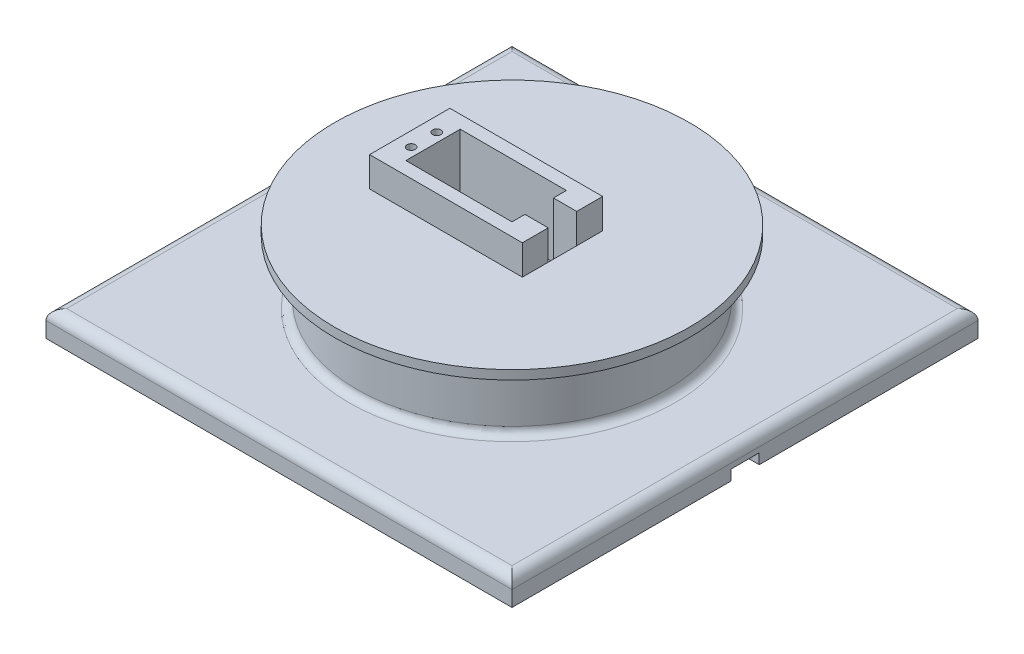
ISO-10303-21;
HEADER;
FILE_DESCRIPTION(('STEP AP214'),'2;1');
FILE_NAME('part.step','',(''),(''),'','','');
FILE_SCHEMA(('AUTOMOTIVE_DESIGN { 1 0 10303 214 1 1 1 1 }'));
ENDSEC;
DATA;
#1=APPLICATION_CONTEXT('core data for automotive mechanical design processes');
#2=APPLICATION_PROTOCOL_DEFINITION('international standard','automotive_design',2000,#1);
#3=PRODUCT_CONTEXT('',#1,'mechanical');
#4=PRODUCT('Part','Part','',(#3));
#5=PRODUCT_RELATED_PRODUCT_CATEGORY('part','',(#4));
#6=PRODUCT_DEFINITION_FORMATION('','',#4);
#7=PRODUCT_DEFINITION_CONTEXT('part definition',#1,'design');
#8=PRODUCT_DEFINITION('design','',#6,#7);
#9=PRODUCT_DEFINITION_SHAPE('','',#8);
#10=(LENGTH_UNIT() NAMED_UNIT(*) SI_UNIT(.MILLI.,.METRE.));
#11=(NAMED_UNIT(*) PLANE_ANGLE_UNIT() SI_UNIT($,.RADIAN.));
#12=(NAMED_UNIT(*) SI_UNIT($,.STERADIAN.) SOLID_ANGLE_UNIT());
#13=UNCERTAINTY_MEASURE_WITH_UNIT(LENGTH_MEASURE(1.E-05),#10,'distance_accuracy_value','');
#14=(GEOMETRIC_REPRESENTATION_CONTEXT(3) GLOBAL_UNCERTAINTY_ASSIGNED_CONTEXT((#13)) GLOBAL_UNIT_ASSIGNED_CONTEXT((#10,
#11,#12)) REPRESENTATION_CONTEXT('',''));
#15=CARTESIAN_POINT('',(0.,0.,0.));
#16=DIRECTION('',(0.,0.,1.));
#17=DIRECTION('',(1.,0.,0.));
#18=AXIS2_PLACEMENT_3D('',#15,#16,#17);
#19=CARTESIAN_POINT('',(19.5,49.5,-15.5));
#20=DIRECTION('',(-1.,0.,0.));
#21=DIRECTION('',(0.,0.,1.));
#22=AXIS2_PLACEMENT_3D('',#19,#20,#21);
#23=PLANE('',#22);
#24=DIRECTION('',(0.,0.,-1.));
#25=VECTOR('',#24,1.);
#26=CARTESIAN_POINT('',(19.5,49.5,-15.5));
#27=LINE('',#26,#25);
#28=CARTESIAN_POINT('',(19.5,49.5,-5.5));
#29=VERTEX_POINT('',#28);
#30=CARTESIAN_POINT('',(19.5,49.5,-15.5));
#31=VERTEX_POINT('',#30);
#32=EDGE_CURVE('E335',#29,#31,#27,.T.);
#33=ORIENTED_EDGE('',*,*,#32,.F.);
#34=DIRECTION('',(0.,1.,0.));
#35=VECTOR('',#34,1.);
#36=CARTESIAN_POINT('',(19.5,-14.2126704035519,-5.5));
#37=LINE('',#36,#35);
#38=CARTESIAN_POINT('',(19.5,38.,-5.5));
#39=VERTEX_POINT('',#38);
#40=EDGE_CURVE('E368',#39,#29,#37,.T.);
#41=ORIENTED_EDGE('',*,*,#40,.F.);
#42=DIRECTION('',(0.,0.,1.));
#43=VECTOR('',#42,1.);
#44=CARTESIAN_POINT('',(19.5,38.,0.));
#45=LINE('',#44,#43);
#46=CARTESIAN_POINT('',(19.5,38.,-15.5));
#47=VERTEX_POINT('',#46);
#48=EDGE_CURVE('E281',#47,#39,#45,.T.);
#49=ORIENTED_EDGE('',*,*,#48,.F.);
#50=DIRECTION('',(0.,-1.,0.));
#51=VECTOR('',#50,1.);
#52=CARTESIAN_POINT('',(19.5,49.5,-15.5));
#53=LINE('',#52,#51);
#54=EDGE_CURVE('E58',#31,#47,#53,.T.);
#55=ORIENTED_EDGE('',*,*,#54,.F.);
#56=EDGE_LOOP('',(#33,#41,#49,#55));
#57=FACE_BOUND('',#56,.T.);
#58=ADVANCED_FACE('F35',(#57),#23,.F.);
#59=CARTESIAN_POINT('',(10.5,23.,-10.5));
#60=DIRECTION('',(1.,0.,0.));
#61=DIRECTION('',(0.,0.,-1.));
#62=AXIS2_PLACEMENT_3D('',#59,#60,#61);
#63=PLANE('',#62);
#64=DIRECTION('',(0.,0.,-1.));
#65=VECTOR('',#64,1.);
#66=CARTESIAN_POINT('',(10.5,23.,-10.5));
#67=LINE('',#66,#65);
#68=CARTESIAN_POINT('',(10.5,23.,-5.5));
#69=VERTEX_POINT('',#68);
#70=CARTESIAN_POINT('',(10.5,23.,-10.5));
#71=VERTEX_POINT('',#70);
#72=EDGE_CURVE('E310',#69,#71,#67,.T.);
#73=ORIENTED_EDGE('',*,*,#72,.F.);
#74=DIRECTION('',(0.,1.,0.));
#75=VECTOR('',#74,1.);
#76=CARTESIAN_POINT('',(10.5,23.,-5.5));
#77=LINE('',#76,#75);
#78=CARTESIAN_POINT('',(10.5,49.5,-5.5));
#79=VERTEX_POINT('',#78);
#80=EDGE_CURVE('E11',#69,#79,#77,.T.);
#81=ORIENTED_EDGE('',*,*,#80,.T.);
#82=DIRECTION('',(0.,0.,-1.));
#83=VECTOR('',#82,1.);
#84=CARTESIAN_POINT('',(10.5,49.5,10.5));
#85=LINE('',#84,#83);
#86=CARTESIAN_POINT('',(10.5,49.5,-10.5));
#87=VERTEX_POINT('',#86);
#88=EDGE_CURVE('E345',#79,#87,#85,.T.);
#89=ORIENTED_EDGE('',*,*,#88,.T.);
#90=DIRECTION('',(0.,1.,0.));
#91=VECTOR('',#90,1.);
#92=CARTESIAN_POINT('',(10.5,23.,-10.5));
#93=LINE('',#92,#91);
#94=EDGE_CURVE('E477',#71,#87,#93,.T.);
#95=ORIENTED_EDGE('',*,*,#94,.F.);
#96=EDGE_LOOP('',(#73,#81,#89,#95));
#97=FACE_BOUND('',#96,.T.);
#98=ADVANCED_FACE('F435',(#97),#63,.F.);
#99=CARTESIAN_POINT('',(0.,38.,0.));
#100=DIRECTION('',(0.,1.,0.));
#101=DIRECTION('',(0.,0.,1.));
#102=AXIS2_PLACEMENT_3D('',#99,#100,#101);
#103=PLANE('',#102);
#104=CARTESIAN_POINT('',(0.,38.,0.));
#105=DIRECTION('',(0.,1.,0.));
#106=DIRECTION('',(0.,0.,1.));
#107=AXIS2_PLACEMENT_3D('',#104,#105,#106);
#108=CIRCLE('',#107,68.5);
#109=CARTESIAN_POINT('',(0.,38.,68.5));
#110=VERTEX_POINT('',#109);
#111=EDGE_CURVE('E225',#110,#110,#108,.T.);
#112=ORIENTED_EDGE('',*,*,#111,.T.);
#113=EDGE_LOOP('',(#112));
#114=FACE_BOUND('',#113,.T.);
#115=DIRECTION('',(-1.,0.,0.));
#116=VECTOR('',#115,1.);
#117=CARTESIAN_POINT('',(0.,38.,15.5));
#118=LINE('',#117,#116);
#119=CARTESIAN_POINT('',(19.5,38.,15.5));
#120=VERTEX_POINT('',#119);
#121=CARTESIAN_POINT('',(-39.5,38.,15.5));
#122=VERTEX_POINT('',#121);
#123=EDGE_CURVE('E284',#120,#122,#118,.T.);
#124=ORIENTED_EDGE('',*,*,#123,.T.);
#125=DIRECTION('',(0.,0.,-1.));
#126=VECTOR('',#125,1.);
#127=CARTESIAN_POINT('',(-39.5,38.,0.));
#128=LINE('',#127,#126);
#129=CARTESIAN_POINT('',(-39.5,38.,-15.5));
#130=VERTEX_POINT('',#129);
#131=EDGE_CURVE('E288',#122,#130,#128,.T.);
#132=ORIENTED_EDGE('',*,*,#131,.T.);
#133=DIRECTION('',(1.,0.,0.));
#134=VECTOR('',#133,1.);
#135=CARTESIAN_POINT('',(0.,38.,-15.5));
#136=LINE('',#135,#134);
#137=EDGE_CURVE('E277',#130,#47,#136,.T.);
#138=ORIENTED_EDGE('',*,*,#137,.T.);
#139=ORIENTED_EDGE('',*,*,#48,.T.);
#140=CARTESIAN_POINT('',(19.5,38.,5.5));
#141=VERTEX_POINT('',#140);
#142=EDGE_CURVE('E285',#39,#141,#45,.T.);
#143=ORIENTED_EDGE('',*,*,#142,.T.);
#144=EDGE_CURVE('E280',#141,#120,#45,.T.);
#145=ORIENTED_EDGE('',*,*,#144,.T.);
#146=EDGE_LOOP('',(#124,#132,#138,#139,#143,#145));
#147=FACE_BOUND('',#146,.T.);
#148=ADVANCED_FACE('F442',(#114,#147),#103,.T.);
#149=CARTESIAN_POINT('',(0.,38.,0.));
#150=DIRECTION('',(0.,-1.,0.));
#151=DIRECTION('',(0.,0.,-1.));
#152=AXIS2_PLACEMENT_3D('',#149,#150,#151);
#153=CYLINDRICAL_SURFACE('',#152,60.);
#154=CARTESIAN_POINT('',(0.,13.,0.));
#155=DIRECTION('',(0.,1.,0.));
#156=DIRECTION('',(0.,0.,1.));
#157=AXIS2_PLACEMENT_3D('',#154,#155,#156);
#158=CIRCLE('',#157,60.);
#159=CARTESIAN_POINT('',(0.,13.,60.));
#160=VERTEX_POINT('',#159);
#161=EDGE_CURVE('E258',#160,#160,#158,.T.);
#162=ORIENTED_EDGE('',*,*,#161,.T.);
#163=EDGE_LOOP('',(#162));
#164=FACE_BOUND('',#163,.T.);
#165=CARTESIAN_POINT('',(0.,34.5,0.));
#166=DIRECTION('',(0.,1.,0.));
#167=DIRECTION('',(0.,0.,1.));
#168=AXIS2_PLACEMENT_3D('',#165,#166,#167);
#169=CIRCLE('',#168,60.);
#170=CARTESIAN_POINT('',(0.,34.5,60.));
#171=VERTEX_POINT('',#170);
#172=EDGE_CURVE('E274',#171,#171,#169,.T.);
#173=ORIENTED_EDGE('',*,*,#172,.F.);
#174=EDGE_LOOP('',(#173));
#175=FACE_BOUND('',#174,.T.);
#176=ADVANCED_FACE('F509',(#164,#175),#153,.T.);
#177=CARTESIAN_POINT('',(90.,10.,-90.));
#178=DIRECTION('',(-1.,0.,0.));
#179=DIRECTION('',(0.,0.,1.));
#180=AXIS2_PLACEMENT_3D('',#177,#178,#179);
#181=PLANE('',#180);
#182=DIRECTION('',(0.,0.,-1.));
#183=VECTOR('',#182,1.);
#184=CARTESIAN_POINT('',(90.,4.,-5.5));
#185=LINE('',#184,#183);
#186=CARTESIAN_POINT('',(90.,4.,5.5));
#187=VERTEX_POINT('',#186);
#188=CARTESIAN_POINT('',(90.,4.,-5.5));
#189=VERTEX_POINT('',#188);
#190=EDGE_CURVE('E210',#187,#189,#185,.T.);
#191=ORIENTED_EDGE('',*,*,#190,.T.);
#192=DIRECTION('',(0.,-1.,0.));
#193=VECTOR('',#192,1.);
#194=CARTESIAN_POINT('',(90.,0.,-5.5));
#195=LINE('',#194,#193);
#196=CARTESIAN_POINT('',(90.,0.,-5.5));
#197=VERTEX_POINT('',#196);
#198=EDGE_CURVE('E382',#189,#197,#195,.T.);
#199=ORIENTED_EDGE('',*,*,#198,.T.);
#200=DIRECTION('',(0.,0.,-1.));
#201=VECTOR('',#200,1.);
#202=CARTESIAN_POINT('',(90.,0.,-90.));
#203=LINE('',#202,#201);
#204=CARTESIAN_POINT('',(90.,0.,-90.));
#205=VERTEX_POINT('',#204);
#206=EDGE_CURVE('E218',#197,#205,#203,.T.);
#207=ORIENTED_EDGE('',*,*,#206,.T.);
#208=DIRECTION('',(0.,-1.,0.));
#209=VECTOR('',#208,1.);
#210=CARTESIAN_POINT('',(90.,10.,-90.));
#211=LINE('',#210,#209);
#212=CARTESIAN_POINT('',(90.,6.,-90.));
#213=VERTEX_POINT('',#212);
#214=EDGE_CURVE('E237',#213,#205,#211,.T.);
#215=ORIENTED_EDGE('',*,*,#214,.F.);
#216=DIRECTION('',(0.,0.,-1.));
#217=VECTOR('',#216,1.);
#218=CARTESIAN_POINT('',(90.,6.,90.));
#219=LINE('',#218,#217);
#220=CARTESIAN_POINT('',(90.,6.,90.));
#221=VERTEX_POINT('',#220);
#222=EDGE_CURVE('E254',#213,#221,#219,.F.);
#223=ORIENTED_EDGE('',*,*,#222,.T.);
#224=DIRECTION('',(0.,-1.,0.));
#225=VECTOR('',#224,1.);
#226=CARTESIAN_POINT('',(90.,10.,90.));
#227=LINE('',#226,#225);
#228=CARTESIAN_POINT('',(90.,0.,90.));
#229=VERTEX_POINT('',#228);
#230=EDGE_CURVE('E215',#221,#229,#227,.T.);
#231=ORIENTED_EDGE('',*,*,#230,.T.);
#232=CARTESIAN_POINT('',(90.,0.,5.5));
#233=VERTEX_POINT('',#232);
#234=EDGE_CURVE('E197',#229,#233,#203,.T.);
#235=ORIENTED_EDGE('',*,*,#234,.T.);
#236=DIRECTION('',(0.,1.,0.));
#237=VECTOR('',#236,1.);
#238=CARTESIAN_POINT('',(90.,0.,5.5));
#239=LINE('',#238,#237);
#240=EDGE_CURVE('E203',#233,#187,#239,.T.);
#241=ORIENTED_EDGE('',*,*,#240,.T.);
#242=EDGE_LOOP('',(#191,#199,#207,#215,#223,#231,#235,#241));
#243=FACE_BOUND('',#242,.T.);
#244=ADVANCED_FACE('F213',(#243),#181,.F.);
#245=CARTESIAN_POINT('',(-90.,10.,-90.));
#246=DIRECTION('',(0.,0.,1.));
#247=DIRECTION('',(1.,0.,0.));
#248=AXIS2_PLACEMENT_3D('',#245,#246,#247);
#249=PLANE('',#248);
#250=DIRECTION('',(0.,-1.,0.));
#251=VECTOR('',#250,1.);
#252=CARTESIAN_POINT('',(-90.,10.,-90.));
#253=LINE('',#252,#251);
#254=CARTESIAN_POINT('',(-90.,6.,-90.));
#255=VERTEX_POINT('',#254);
#256=CARTESIAN_POINT('',(-90.,0.,-90.));
#257=VERTEX_POINT('',#256);
#258=EDGE_CURVE('E235',#255,#257,#253,.T.);
#259=ORIENTED_EDGE('',*,*,#258,.F.);
#260=DIRECTION('',(-1.,0.,0.));
#261=VECTOR('',#260,1.);
#262=CARTESIAN_POINT('',(90.,6.,-90.));
#263=LINE('',#262,#261);
#264=EDGE_CURVE('E249',#255,#213,#263,.F.);
#265=ORIENTED_EDGE('',*,*,#264,.T.);
#266=ORIENTED_EDGE('',*,*,#214,.T.);
#267=DIRECTION('',(-1.,0.,0.));
#268=VECTOR('',#267,1.);
#269=CARTESIAN_POINT('',(-90.,0.,-90.));
#270=LINE('',#269,#268);
#271=EDGE_CURVE('E217',#205,#257,#270,.T.);
#272=ORIENTED_EDGE('',*,*,#271,.T.);
#273=EDGE_LOOP('',(#259,#265,#266,#272));
#274=FACE_BOUND('',#273,.T.);
#275=ADVANCED_FACE('F401',(#274),#249,.F.);
#276=CARTESIAN_POINT('',(-90.,10.,-90.));
#277=DIRECTION('',(1.,0.,0.));
#278=DIRECTION('',(0.,0.,-1.));
#279=AXIS2_PLACEMENT_3D('',#276,#277,#278);
#280=PLANE('',#279);
#281=DIRECTION('',(0.,-1.,0.));
#282=VECTOR('',#281,1.);
#283=CARTESIAN_POINT('',(-90.,10.,90.));
#284=LINE('',#283,#282);
#285=CARTESIAN_POINT('',(-90.,6.,90.));
#286=VERTEX_POINT('',#285);
#287=CARTESIAN_POINT('',(-90.,0.,90.));
#288=VERTEX_POINT('',#287);
#289=EDGE_CURVE('E233',#286,#288,#284,.T.);
#290=ORIENTED_EDGE('',*,*,#289,.F.);
#291=DIRECTION('',(0.,0.,1.));
#292=VECTOR('',#291,1.);
#293=CARTESIAN_POINT('',(-90.,6.,-90.));
#294=LINE('',#293,#292);
#295=EDGE_CURVE('E252',#286,#255,#294,.F.);
#296=ORIENTED_EDGE('',*,*,#295,.T.);
#297=ORIENTED_EDGE('',*,*,#258,.T.);
#298=DIRECTION('',(0.,0.,1.));
#299=VECTOR('',#298,1.);
#300=CARTESIAN_POINT('',(-90.,0.,-90.));
#301=LINE('',#300,#299);
#302=EDGE_CURVE('E221',#257,#288,#301,.T.);
#303=ORIENTED_EDGE('',*,*,#302,.T.);
#304=EDGE_LOOP('',(#290,#296,#297,#303));
#305=FACE_BOUND('',#304,.T.);
#306=ADVANCED_FACE('F518',(#305),#280,.F.);
#307=CARTESIAN_POINT('',(-90.,10.,90.));
#308=DIRECTION('',(0.,0.,-1.));
#309=DIRECTION('',(-1.,0.,0.));
#310=AXIS2_PLACEMENT_3D('',#307,#308,#309);
#311=PLANE('',#310);
#312=ORIENTED_EDGE('',*,*,#230,.F.);
#313=DIRECTION('',(1.,0.,0.));
#314=VECTOR('',#313,1.);
#315=CARTESIAN_POINT('',(-90.,6.,90.));
#316=LINE('',#315,#314);
#317=EDGE_CURVE('E256',#221,#286,#316,.F.);
#318=ORIENTED_EDGE('',*,*,#317,.T.);
#319=ORIENTED_EDGE('',*,*,#289,.T.);
#320=DIRECTION('',(1.,0.,0.));
#321=VECTOR('',#320,1.);
#322=CARTESIAN_POINT('',(-90.,0.,90.));
#323=LINE('',#322,#321);
#324=EDGE_CURVE('E230',#288,#229,#323,.T.);
#325=ORIENTED_EDGE('',*,*,#324,.T.);
#326=EDGE_LOOP('',(#312,#318,#319,#325));
#327=FACE_BOUND('',#326,.T.);
#328=ADVANCED_FACE('F423',(#327),#311,.F.);
#329=CARTESIAN_POINT('',(0.,10.,0.));
#330=DIRECTION('',(0.,1.,0.));
#331=DIRECTION('',(0.,0.,1.));
#332=AXIS2_PLACEMENT_3D('',#329,#330,#331);
#333=PLANE('',#332);
#334=CARTESIAN_POINT('',(0.,10.,0.));
#335=DIRECTION('',(0.,1.,0.));
#336=DIRECTION('',(0.,0.,1.));
#337=AXIS2_PLACEMENT_3D('',#334,#335,#336);
#338=CIRCLE('',#337,63.);
#339=CARTESIAN_POINT('',(0.,10.,63.));
#340=VERTEX_POINT('',#339);
#341=EDGE_CURVE('E271',#340,#340,#338,.F.);
#342=ORIENTED_EDGE('',*,*,#341,.T.);
#343=EDGE_LOOP('',(#342));
#344=FACE_BOUND('',#343,.T.);
#345=DIRECTION('',(0.,0.,-1.));
#346=VECTOR('',#345,1.);
#347=CARTESIAN_POINT('',(86.,10.,-90.));
#348=LINE('',#347,#346);
#349=CARTESIAN_POINT('',(86.,10.,86.));
#350=VERTEX_POINT('',#349);
#351=CARTESIAN_POINT('',(86.,10.,-86.));
#352=VERTEX_POINT('',#351);
#353=EDGE_CURVE('E242',#350,#352,#348,.T.);
#354=ORIENTED_EDGE('',*,*,#353,.T.);
#355=DIRECTION('',(-1.,0.,0.));
#356=VECTOR('',#355,1.);
#357=CARTESIAN_POINT('',(-90.,10.,-86.));
#358=LINE('',#357,#356);
#359=CARTESIAN_POINT('',(-86.,10.,-86.));
#360=VERTEX_POINT('',#359);
#361=EDGE_CURVE('E246',#352,#360,#358,.T.);
#362=ORIENTED_EDGE('',*,*,#361,.T.);
#363=DIRECTION('',(0.,0.,1.));
#364=VECTOR('',#363,1.);
#365=CARTESIAN_POINT('',(-86.,10.,90.));
#366=LINE('',#365,#364);
#367=CARTESIAN_POINT('',(-86.,10.,86.));
#368=VERTEX_POINT('',#367);
#369=EDGE_CURVE('E244',#360,#368,#366,.T.);
#370=ORIENTED_EDGE('',*,*,#369,.T.);
#371=DIRECTION('',(1.,0.,0.));
#372=VECTOR('',#371,1.);
#373=CARTESIAN_POINT('',(90.,10.,86.));
#374=LINE('',#373,#372);
#375=EDGE_CURVE('E240',#368,#350,#374,.T.);
#376=ORIENTED_EDGE('',*,*,#375,.T.);
#377=EDGE_LOOP('',(#354,#362,#370,#376));
#378=FACE_BOUND('',#377,.T.);
#379=ADVANCED_FACE('F416',(#344,#378),#333,.T.);
#380=CARTESIAN_POINT('',(0.,0.,0.));
#381=DIRECTION('',(0.,1.,0.));
#382=DIRECTION('',(0.,0.,1.));
#383=AXIS2_PLACEMENT_3D('',#380,#381,#382);
#384=PLANE('',#383);
#385=ORIENTED_EDGE('',*,*,#206,.F.);
#386=DIRECTION('',(1.,0.,0.));
#387=VECTOR('',#386,1.);
#388=CARTESIAN_POINT('',(10.5,0.,-5.5));
#389=LINE('',#388,#387);
#390=CARTESIAN_POINT('',(10.5,0.,-5.5));
#391=VERTEX_POINT('',#390);
#392=EDGE_CURVE('E374',#391,#197,#389,.T.);
#393=ORIENTED_EDGE('',*,*,#392,.F.);
#394=DIRECTION('',(0.,0.,-1.));
#395=VECTOR('',#394,1.);
#396=CARTESIAN_POINT('',(10.5,0.,5.5));
#397=LINE('',#396,#395);
#398=CARTESIAN_POINT('',(10.5,0.,5.5));
#399=VERTEX_POINT('',#398);
#400=EDGE_CURVE('E199',#399,#391,#397,.T.);
#401=ORIENTED_EDGE('',*,*,#400,.F.);
#402=DIRECTION('',(-1.,0.,0.));
#403=VECTOR('',#402,1.);
#404=CARTESIAN_POINT('',(10.5,0.,5.5));
#405=LINE('',#404,#403);
#406=EDGE_CURVE('E191',#233,#399,#405,.T.);
#407=ORIENTED_EDGE('',*,*,#406,.F.);
#408=ORIENTED_EDGE('',*,*,#234,.F.);
#409=ORIENTED_EDGE('',*,*,#324,.F.);
#410=ORIENTED_EDGE('',*,*,#302,.F.);
#411=ORIENTED_EDGE('',*,*,#271,.F.);
#412=EDGE_LOOP('',(#385,#393,#401,#407,#408,#409,#410,#411));
#413=FACE_BOUND('',#412,.T.);
#414=ADVANCED_FACE('F194',(#413),#384,.F.);
#415=CARTESIAN_POINT('',(0.,6.,86.));
#416=DIRECTION('',(-1.,0.,0.));
#417=DIRECTION('',(0.,0.,1.));
#418=AXIS2_PLACEMENT_3D('',#415,#416,#417);
#419=CYLINDRICAL_SURFACE('',#418,4.);
#420=CARTESIAN_POINT('',(-86.,6.,86.));
#421=DIRECTION('',(-0.707106781186548,0.,-0.707106781186547));
#422=DIRECTION('',(-0.707106781186547,0.,0.707106781186548));
#423=AXIS2_PLACEMENT_3D('',#420,#421,#422);
#424=ELLIPSE('',#423,5.65685424949238,4.);
#425=EDGE_CURVE('E264',#286,#368,#424,.T.);
#426=ORIENTED_EDGE('',*,*,#425,.F.);
#427=ORIENTED_EDGE('',*,*,#317,.F.);
#428=CARTESIAN_POINT('',(86.,6.,86.));
#429=DIRECTION('',(-0.707106781186547,0.,0.707106781186548));
#430=DIRECTION('',(-0.707106781186548,0.,-0.707106781186547));
#431=AXIS2_PLACEMENT_3D('',#428,#429,#430);
#432=ELLIPSE('',#431,5.65685424949238,4.);
#433=EDGE_CURVE('E223',#350,#221,#432,.F.);
#434=ORIENTED_EDGE('',*,*,#433,.F.);
#435=ORIENTED_EDGE('',*,*,#375,.F.);
#436=EDGE_LOOP('',(#426,#427,#434,#435));
#437=FACE_BOUND('',#436,.T.);
#438=ADVANCED_FACE('F426',(#437),#419,.T.);
#439=CARTESIAN_POINT('',(86.,6.,0.));
#440=DIRECTION('',(0.,0.,1.));
#441=DIRECTION('',(1.,0.,0.));
#442=AXIS2_PLACEMENT_3D('',#439,#440,#441);
#443=CYLINDRICAL_SURFACE('',#442,4.);
#444=ORIENTED_EDGE('',*,*,#433,.T.);
#445=ORIENTED_EDGE('',*,*,#222,.F.);
#446=CARTESIAN_POINT('',(86.,6.,-86.));
#447=DIRECTION('',(0.707106781186548,0.,0.707106781186547));
#448=DIRECTION('',(-0.707106781186547,0.,0.707106781186548));
#449=AXIS2_PLACEMENT_3D('',#446,#447,#448);
#450=ELLIPSE('',#449,5.65685424949238,4.);
#451=EDGE_CURVE('E261',#352,#213,#450,.F.);
#452=ORIENTED_EDGE('',*,*,#451,.F.);
#453=ORIENTED_EDGE('',*,*,#353,.F.);
#454=EDGE_LOOP('',(#444,#445,#452,#453));
#455=FACE_BOUND('',#454,.T.);
#456=ADVANCED_FACE('F420',(#455),#443,.T.);
#457=CARTESIAN_POINT('',(-86.,6.,0.));
#458=DIRECTION('',(0.,0.,-1.));
#459=DIRECTION('',(-1.,0.,0.));
#460=AXIS2_PLACEMENT_3D('',#457,#458,#459);
#461=CYLINDRICAL_SURFACE('',#460,4.);
#462=ORIENTED_EDGE('',*,*,#425,.T.);
#463=ORIENTED_EDGE('',*,*,#369,.F.);
#464=CARTESIAN_POINT('',(-86.,6.,-86.));
#465=DIRECTION('',(0.707106781186547,0.,-0.707106781186548));
#466=DIRECTION('',(-0.707106781186548,0.,-0.707106781186547));
#467=AXIS2_PLACEMENT_3D('',#464,#465,#466);
#468=ELLIPSE('',#467,5.65685424949238,4.);
#469=EDGE_CURVE('E259',#255,#360,#468,.T.);
#470=ORIENTED_EDGE('',*,*,#469,.F.);
#471=ORIENTED_EDGE('',*,*,#295,.F.);
#472=EDGE_LOOP('',(#462,#463,#470,#471));
#473=FACE_BOUND('',#472,.T.);
#474=ADVANCED_FACE('F412',(#473),#461,.T.);
#475=CARTESIAN_POINT('',(0.,6.,-86.));
#476=DIRECTION('',(1.,0.,0.));
#477=DIRECTION('',(0.,0.,-1.));
#478=AXIS2_PLACEMENT_3D('',#475,#476,#477);
#479=CYLINDRICAL_SURFACE('',#478,4.);
#480=ORIENTED_EDGE('',*,*,#451,.T.);
#481=ORIENTED_EDGE('',*,*,#264,.F.);
#482=ORIENTED_EDGE('',*,*,#469,.T.);
#483=ORIENTED_EDGE('',*,*,#361,.F.);
#484=EDGE_LOOP('',(#480,#481,#482,#483));
#485=FACE_BOUND('',#484,.T.);
#486=ADVANCED_FACE('F405',(#485),#479,.T.);
#487=CARTESIAN_POINT('',(0.,13.,0.));
#488=DIRECTION('',(0.,1.,0.));
#489=DIRECTION('',(0.,0.,1.));
#490=AXIS2_PLACEMENT_3D('',#487,#488,#489);
#491=TOROIDAL_SURFACE('',#490,63.,3.);
#492=ORIENTED_EDGE('',*,*,#341,.F.);
#493=EDGE_LOOP('',(#492));
#494=FACE_BOUND('',#493,.T.);
#495=ORIENTED_EDGE('',*,*,#161,.F.);
#496=EDGE_LOOP('',(#495));
#497=FACE_BOUND('',#496,.T.);
#498=ADVANCED_FACE('F37',(#494,#497),#491,.F.);
#499=CARTESIAN_POINT('',(0.,34.5,0.));
#500=DIRECTION('',(0.,1.,0.));
#501=DIRECTION('',(0.,0.,1.));
#502=AXIS2_PLACEMENT_3D('',#499,#500,#501);
#503=CYLINDRICAL_SURFACE('',#502,68.5);
#504=CARTESIAN_POINT('',(0.,34.5,0.));
#505=DIRECTION('',(0.,1.,0.));
#506=DIRECTION('',(0.,0.,1.));
#507=AXIS2_PLACEMENT_3D('',#504,#505,#506);
#508=CIRCLE('',#507,68.5);
#509=CARTESIAN_POINT('',(0.,34.5,68.5));
#510=VERTEX_POINT('',#509);
#511=EDGE_CURVE('E262',#510,#510,#508,.T.);
#512=ORIENTED_EDGE('',*,*,#511,.T.);
#513=EDGE_LOOP('',(#512));
#514=FACE_BOUND('',#513,.T.);
#515=ORIENTED_EDGE('',*,*,#111,.F.);
#516=EDGE_LOOP('',(#515));
#517=FACE_BOUND('',#516,.T.);
#518=ADVANCED_FACE('F494',(#514,#517),#503,.T.);
#519=CARTESIAN_POINT('',(0.,34.5,0.));
#520=DIRECTION('',(0.,1.,0.));
#521=DIRECTION('',(0.,0.,1.));
#522=AXIS2_PLACEMENT_3D('',#519,#520,#521);
#523=PLANE('',#522);
#524=ORIENTED_EDGE('',*,*,#172,.T.);
#525=EDGE_LOOP('',(#524));
#526=FACE_BOUND('',#525,.T.);
#527=ORIENTED_EDGE('',*,*,#511,.F.);
#528=EDGE_LOOP('',(#527));
#529=FACE_BOUND('',#528,.T.);
#530=ADVANCED_FACE('F496',(#526,#529),#523,.F.);
#531=CARTESIAN_POINT('',(0.,49.5,0.));
#532=DIRECTION('',(0.,-1.,0.));
#533=DIRECTION('',(0.,0.,-1.));
#534=AXIS2_PLACEMENT_3D('',#531,#532,#533);
#535=PLANE('',#534);
#536=CARTESIAN_POINT('',(-34.,49.5,-4.95));
#537=DIRECTION('',(0.,1.,0.));
#538=DIRECTION('',(0.,0.,1.));
#539=AXIS2_PLACEMENT_3D('',#536,#537,#538);
#540=CIRCLE('',#539,1.6);
#541=CARTESIAN_POINT('',(-34.,49.5,-3.35000000000001));
#542=VERTEX_POINT('',#541);
#543=EDGE_CURVE('E200',#542,#542,#540,.T.);
#544=ORIENTED_EDGE('',*,*,#543,.F.);
#545=EDGE_LOOP('',(#544));
#546=FACE_BOUND('',#545,.T.);
#547=CARTESIAN_POINT('',(-34.,49.5,4.95));
#548=DIRECTION('',(0.,1.,0.));
#549=DIRECTION('',(0.,0.,1.));
#550=AXIS2_PLACEMENT_3D('',#547,#548,#549);
#551=CIRCLE('',#550,1.6);
#552=CARTESIAN_POINT('',(-34.,49.5,6.55));
#553=VERTEX_POINT('',#552);
#554=EDGE_CURVE('E355',#553,#553,#551,.T.);
#555=ORIENTED_EDGE('',*,*,#554,.F.);
#556=EDGE_LOOP('',(#555));
#557=FACE_BOUND('',#556,.T.);
#558=ORIENTED_EDGE('',*,*,#88,.F.);
#559=DIRECTION('',(-1.,0.,0.));
#560=VECTOR('',#559,1.);
#561=CARTESIAN_POINT('',(10.5,49.5,-5.5));
#562=LINE('',#561,#560);
#563=EDGE_CURVE('E365',#29,#79,#562,.T.);
#564=ORIENTED_EDGE('',*,*,#563,.F.);
#565=ORIENTED_EDGE('',*,*,#32,.T.);
#566=DIRECTION('',(-1.,0.,0.));
#567=VECTOR('',#566,1.);
#568=CARTESIAN_POINT('',(19.5,49.5,-15.5));
#569=LINE('',#568,#567);
#570=CARTESIAN_POINT('',(-39.5,49.5,-15.5));
#571=VERTEX_POINT('',#570);
#572=EDGE_CURVE('E330',#31,#571,#569,.T.);
#573=ORIENTED_EDGE('',*,*,#572,.T.);
#574=DIRECTION('',(0.,0.,1.));
#575=VECTOR('',#574,1.);
#576=CARTESIAN_POINT('',(-39.5,49.5,-15.5));
#577=LINE('',#576,#575);
#578=CARTESIAN_POINT('',(-39.5,49.5,15.5));
#579=VERTEX_POINT('',#578);
#580=EDGE_CURVE('E338',#571,#579,#577,.T.);
#581=ORIENTED_EDGE('',*,*,#580,.T.);
#582=DIRECTION('',(1.,0.,0.));
#583=VECTOR('',#582,1.);
#584=CARTESIAN_POINT('',(19.5,49.5,15.5));
#585=LINE('',#584,#583);
#586=CARTESIAN_POINT('',(19.5,49.5,15.5));
#587=VERTEX_POINT('',#586);
#588=EDGE_CURVE('E336',#579,#587,#585,.T.);
#589=ORIENTED_EDGE('',*,*,#588,.T.);
#590=CARTESIAN_POINT('',(19.5,49.5,5.5));
#591=VERTEX_POINT('',#590);
#592=EDGE_CURVE('E332',#587,#591,#27,.T.);
#593=ORIENTED_EDGE('',*,*,#592,.T.);
#594=DIRECTION('',(1.,0.,0.));
#595=VECTOR('',#594,1.);
#596=CARTESIAN_POINT('',(10.5,49.5,5.5));
#597=LINE('',#596,#595);
#598=CARTESIAN_POINT('',(10.5,49.5,5.5));
#599=VERTEX_POINT('',#598);
#600=EDGE_CURVE('E376',#599,#591,#597,.T.);
#601=ORIENTED_EDGE('',*,*,#600,.F.);
#602=CARTESIAN_POINT('',(10.5,49.5,10.5));
#603=VERTEX_POINT('',#602);
#604=EDGE_CURVE('E299',#603,#599,#85,.T.);
#605=ORIENTED_EDGE('',*,*,#604,.F.);
#606=DIRECTION('',(1.,0.,0.));
#607=VECTOR('',#606,1.);
#608=CARTESIAN_POINT('',(-30.5,49.5,10.5));
#609=LINE('',#608,#607);
#610=CARTESIAN_POINT('',(-30.5,49.5,10.5));
#611=VERTEX_POINT('',#610);
#612=EDGE_CURVE('E346',#611,#603,#609,.T.);
#613=ORIENTED_EDGE('',*,*,#612,.F.);
#614=DIRECTION('',(0.,0.,1.));
#615=VECTOR('',#614,1.);
#616=CARTESIAN_POINT('',(-30.5,49.5,-10.5));
#617=LINE('',#616,#615);
#618=CARTESIAN_POINT('',(-30.5,49.5,-10.5));
#619=VERTEX_POINT('',#618);
#620=EDGE_CURVE('E349',#619,#611,#617,.T.);
#621=ORIENTED_EDGE('',*,*,#620,.F.);
#622=DIRECTION('',(-1.,0.,0.));
#623=VECTOR('',#622,1.);
#624=CARTESIAN_POINT('',(10.5,49.5,-10.5));
#625=LINE('',#624,#623);
#626=EDGE_CURVE('E341',#87,#619,#625,.T.);
#627=ORIENTED_EDGE('',*,*,#626,.F.);
#628=EDGE_LOOP('',(#558,#564,#565,#573,#581,#589,#593,#601,#605,#613,#621,#627));
#629=FACE_BOUND('',#628,.T.);
#630=ADVANCED_FACE('F473',(#546,#557,#629),#535,.F.);
#631=CARTESIAN_POINT('',(-39.5,49.5,-15.5));
#632=DIRECTION('',(1.,0.,0.));
#633=DIRECTION('',(0.,0.,-1.));
#634=AXIS2_PLACEMENT_3D('',#631,#632,#633);
#635=PLANE('',#634);
#636=ORIENTED_EDGE('',*,*,#131,.F.);
#637=DIRECTION('',(0.,-1.,0.));
#638=VECTOR('',#637,1.);
#639=CARTESIAN_POINT('',(-39.5,49.5,15.5));
#640=LINE('',#639,#638);
#641=EDGE_CURVE('E318',#579,#122,#640,.T.);
#642=ORIENTED_EDGE('',*,*,#641,.F.);
#643=ORIENTED_EDGE('',*,*,#580,.F.);
#644=DIRECTION('',(0.,-1.,0.));
#645=VECTOR('',#644,1.);
#646=CARTESIAN_POINT('',(-39.5,49.5,-15.5));
#647=LINE('',#646,#645);
#648=EDGE_CURVE('E327',#571,#130,#647,.T.);
#649=ORIENTED_EDGE('',*,*,#648,.T.);
#650=EDGE_LOOP('',(#636,#642,#643,#649));
#651=FACE_BOUND('',#650,.T.);
#652=ADVANCED_FACE('F456',(#651),#635,.F.);
#653=CARTESIAN_POINT('',(19.5,49.5,15.5));
#654=DIRECTION('',(0.,0.,-1.));
#655=DIRECTION('',(-1.,0.,0.));
#656=AXIS2_PLACEMENT_3D('',#653,#654,#655);
#657=PLANE('',#656);
#658=ORIENTED_EDGE('',*,*,#123,.F.);
#659=DIRECTION('',(0.,-1.,0.));
#660=VECTOR('',#659,1.);
#661=CARTESIAN_POINT('',(19.5,49.5,15.5));
#662=LINE('',#661,#660);
#663=EDGE_CURVE('E323',#587,#120,#662,.T.);
#664=ORIENTED_EDGE('',*,*,#663,.F.);
#665=ORIENTED_EDGE('',*,*,#588,.F.);
#666=ORIENTED_EDGE('',*,*,#641,.T.);
#667=EDGE_LOOP('',(#658,#664,#665,#666));
#668=FACE_BOUND('',#667,.T.);
#669=ADVANCED_FACE('F450',(#668),#657,.F.);
#670=ORIENTED_EDGE('',*,*,#144,.F.);
#671=DIRECTION('',(0.,1.,0.));
#672=VECTOR('',#671,1.);
#673=CARTESIAN_POINT('',(19.5,-14.2126704035519,5.5));
#674=LINE('',#673,#672);
#675=EDGE_CURVE('E364',#141,#591,#674,.T.);
#676=ORIENTED_EDGE('',*,*,#675,.T.);
#677=ORIENTED_EDGE('',*,*,#592,.F.);
#678=ORIENTED_EDGE('',*,*,#663,.T.);
#679=EDGE_LOOP('',(#670,#676,#677,#678));
#680=FACE_BOUND('',#679,.T.);
#681=ADVANCED_FACE('F438',(#680),#23,.F.);
#682=CARTESIAN_POINT('',(19.5,49.5,-15.5));
#683=DIRECTION('',(0.,0.,1.));
#684=DIRECTION('',(1.,0.,0.));
#685=AXIS2_PLACEMENT_3D('',#682,#683,#684);
#686=PLANE('',#685);
#687=ORIENTED_EDGE('',*,*,#137,.F.);
#688=ORIENTED_EDGE('',*,*,#648,.F.);
#689=ORIENTED_EDGE('',*,*,#572,.F.);
#690=ORIENTED_EDGE('',*,*,#54,.T.);
#691=EDGE_LOOP('',(#687,#688,#689,#690));
#692=FACE_BOUND('',#691,.T.);
#693=ADVANCED_FACE('F449',(#692),#686,.F.);
#694=CARTESIAN_POINT('',(0.,23.,0.));
#695=DIRECTION('',(0.,-1.,0.));
#696=DIRECTION('',(0.,0.,-1.));
#697=AXIS2_PLACEMENT_3D('',#694,#695,#696);
#698=PLANE('',#697);
#699=DIRECTION('',(0.,0.,1.));
#700=VECTOR('',#699,1.);
#701=CARTESIAN_POINT('',(-30.5,23.,-10.5));
#702=LINE('',#701,#700);
#703=CARTESIAN_POINT('',(-30.5,23.,-10.5));
#704=VERTEX_POINT('',#703);
#705=CARTESIAN_POINT('',(-30.5,23.,10.5));
#706=VERTEX_POINT('',#705);
#707=EDGE_CURVE('E317',#704,#706,#702,.T.);
#708=ORIENTED_EDGE('',*,*,#707,.T.);
#709=DIRECTION('',(1.,0.,0.));
#710=VECTOR('',#709,1.);
#711=CARTESIAN_POINT('',(10.5,23.,10.5));
#712=LINE('',#711,#710);
#713=CARTESIAN_POINT('',(10.5,23.,10.5));
#714=VERTEX_POINT('',#713);
#715=EDGE_CURVE('E307',#706,#714,#712,.T.);
#716=ORIENTED_EDGE('',*,*,#715,.T.);
#717=CARTESIAN_POINT('',(10.5,23.,5.49999999999999));
#718=VERTEX_POINT('',#717);
#719=EDGE_CURVE('E296',#714,#718,#67,.T.);
#720=ORIENTED_EDGE('',*,*,#719,.T.);
#721=EDGE_CURVE('E305',#718,#69,#67,.T.);
#722=ORIENTED_EDGE('',*,*,#721,.T.);
#723=ORIENTED_EDGE('',*,*,#72,.T.);
#724=DIRECTION('',(-1.,0.,0.));
#725=VECTOR('',#724,1.);
#726=CARTESIAN_POINT('',(10.5,23.,-10.5));
#727=LINE('',#726,#725);
#728=EDGE_CURVE('E308',#71,#704,#727,.T.);
#729=ORIENTED_EDGE('',*,*,#728,.T.);
#730=EDGE_LOOP('',(#708,#716,#720,#722,#723,#729));
#731=FACE_BOUND('',#730,.T.);
#732=ADVANCED_FACE('F304',(#731),#698,.F.);
#733=CARTESIAN_POINT('',(10.5,23.,-10.5));
#734=DIRECTION('',(0.,0.,-1.));
#735=DIRECTION('',(-1.,0.,0.));
#736=AXIS2_PLACEMENT_3D('',#733,#734,#735);
#737=PLANE('',#736);
#738=ORIENTED_EDGE('',*,*,#94,.T.);
#739=ORIENTED_EDGE('',*,*,#626,.T.);
#740=DIRECTION('',(0.,1.,0.));
#741=VECTOR('',#740,1.);
#742=CARTESIAN_POINT('',(-30.5,23.,-10.5));
#743=LINE('',#742,#741);
#744=EDGE_CURVE('E481',#704,#619,#743,.T.);
#745=ORIENTED_EDGE('',*,*,#744,.F.);
#746=ORIENTED_EDGE('',*,*,#728,.F.);
#747=EDGE_LOOP('',(#738,#739,#745,#746));
#748=FACE_BOUND('',#747,.T.);
#749=ADVANCED_FACE('F480',(#748),#737,.F.);
#750=ORIENTED_EDGE('',*,*,#604,.T.);
#751=DIRECTION('',(0.,-1.,0.));
#752=VECTOR('',#751,1.);
#753=CARTESIAN_POINT('',(10.5,23.,5.5));
#754=LINE('',#753,#752);
#755=EDGE_CURVE('E43',#599,#718,#754,.T.);
#756=ORIENTED_EDGE('',*,*,#755,.T.);
#757=ORIENTED_EDGE('',*,*,#719,.F.);
#758=DIRECTION('',(0.,1.,0.));
#759=VECTOR('',#758,1.);
#760=CARTESIAN_POINT('',(10.5,23.,10.5));
#761=LINE('',#760,#759);
#762=EDGE_CURVE('E482',#714,#603,#761,.T.);
#763=ORIENTED_EDGE('',*,*,#762,.T.);
#764=EDGE_LOOP('',(#750,#756,#757,#763));
#765=FACE_BOUND('',#764,.T.);
#766=ADVANCED_FACE('F295',(#765),#63,.F.);
#767=CARTESIAN_POINT('',(10.5,23.,10.5));
#768=DIRECTION('',(0.,0.,1.));
#769=DIRECTION('',(1.,0.,0.));
#770=AXIS2_PLACEMENT_3D('',#767,#768,#769);
#771=PLANE('',#770);
#772=DIRECTION('',(0.,1.,0.));
#773=VECTOR('',#772,1.);
#774=CARTESIAN_POINT('',(-30.5,23.,10.5));
#775=LINE('',#774,#773);
#776=EDGE_CURVE('E312',#706,#611,#775,.T.);
#777=ORIENTED_EDGE('',*,*,#776,.T.);
#778=ORIENTED_EDGE('',*,*,#612,.T.);
#779=ORIENTED_EDGE('',*,*,#762,.F.);
#780=ORIENTED_EDGE('',*,*,#715,.F.);
#781=EDGE_LOOP('',(#777,#778,#779,#780));
#782=FACE_BOUND('',#781,.T.);
#783=ADVANCED_FACE('F602',(#782),#771,.F.);
#784=CARTESIAN_POINT('',(-30.5,23.,-10.5));
#785=DIRECTION('',(-1.,0.,0.));
#786=DIRECTION('',(0.,0.,1.));
#787=AXIS2_PLACEMENT_3D('',#784,#785,#786);
#788=PLANE('',#787);
#789=ORIENTED_EDGE('',*,*,#744,.T.);
#790=ORIENTED_EDGE('',*,*,#620,.T.);
#791=ORIENTED_EDGE('',*,*,#776,.F.);
#792=ORIENTED_EDGE('',*,*,#707,.F.);
#793=EDGE_LOOP('',(#789,#790,#791,#792));
#794=FACE_BOUND('',#793,.T.);
#795=ADVANCED_FACE('F607',(#794),#788,.F.);
#796=CARTESIAN_POINT('',(-34.,45.5,4.95));
#797=DIRECTION('',(0.,1.,0.));
#798=DIRECTION('',(0.,0.,1.));
#799=AXIS2_PLACEMENT_3D('',#796,#797,#798);
#800=CONICAL_SURFACE('',#799,1.6,1.02974425867665);
#801=CARTESIAN_POINT('',(-34.,44.5386230095559,4.95));
#802=VERTEX_POINT('',#801);
#803=VERTEX_LOOP('',#802);
#804=FACE_BOUND('',#803,.T.);
#805=CARTESIAN_POINT('',(-34.,45.5,4.95));
#806=DIRECTION('',(0.,1.,0.));
#807=DIRECTION('',(0.,0.,1.));
#808=AXIS2_PLACEMENT_3D('',#805,#806,#807);
#809=CIRCLE('',#808,1.6);
#810=CARTESIAN_POINT('',(-34.,45.5,6.55));
#811=VERTEX_POINT('',#810);
#812=EDGE_CURVE('E352',#811,#811,#809,.T.);
#813=ORIENTED_EDGE('',*,*,#812,.T.);
#814=EDGE_LOOP('',(#813));
#815=FACE_BOUND('',#814,.T.);
#816=ADVANCED_FACE('F618',(#804,#815),#800,.F.);
#817=CARTESIAN_POINT('',(-34.,49.5,4.95));
#818=DIRECTION('',(0.,1.,0.));
#819=DIRECTION('',(0.,0.,1.));
#820=AXIS2_PLACEMENT_3D('',#817,#818,#819);
#821=CYLINDRICAL_SURFACE('',#820,1.6);
#822=ORIENTED_EDGE('',*,*,#812,.F.);
#823=EDGE_LOOP('',(#822));
#824=FACE_BOUND('',#823,.T.);
#825=ORIENTED_EDGE('',*,*,#554,.T.);
#826=EDGE_LOOP('',(#825));
#827=FACE_BOUND('',#826,.T.);
#828=ADVANCED_FACE('F627',(#824,#827),#821,.F.);
#829=CARTESIAN_POINT('',(-34.,45.5,-4.95));
#830=DIRECTION('',(0.,1.,0.));
#831=DIRECTION('',(0.,0.,1.));
#832=AXIS2_PLACEMENT_3D('',#829,#830,#831);
#833=CONICAL_SURFACE('',#832,1.6,1.02974425867665);
#834=CARTESIAN_POINT('',(-34.,44.5386230095559,-4.95));
#835=VERTEX_POINT('',#834);
#836=VERTEX_LOOP('',#835);
#837=FACE_BOUND('',#836,.T.);
#838=CARTESIAN_POINT('',(-34.,45.5,-4.95));
#839=DIRECTION('',(0.,1.,0.));
#840=DIRECTION('',(0.,0.,1.));
#841=AXIS2_PLACEMENT_3D('',#838,#839,#840);
#842=CIRCLE('',#841,1.6);
#843=CARTESIAN_POINT('',(-34.,45.5,-3.35000000000001));
#844=VERTEX_POINT('',#843);
#845=EDGE_CURVE('E358',#844,#844,#842,.T.);
#846=ORIENTED_EDGE('',*,*,#845,.T.);
#847=EDGE_LOOP('',(#846));
#848=FACE_BOUND('',#847,.T.);
#849=ADVANCED_FACE('F637',(#837,#848),#833,.F.);
#850=CARTESIAN_POINT('',(-34.,49.5,-4.95));
#851=DIRECTION('',(0.,1.,0.));
#852=DIRECTION('',(0.,0.,1.));
#853=AXIS2_PLACEMENT_3D('',#850,#851,#852);
#854=CYLINDRICAL_SURFACE('',#853,1.6);
#855=ORIENTED_EDGE('',*,*,#845,.F.);
#856=EDGE_LOOP('',(#855));
#857=FACE_BOUND('',#856,.T.);
#858=ORIENTED_EDGE('',*,*,#543,.T.);
#859=EDGE_LOOP('',(#858));
#860=FACE_BOUND('',#859,.T.);
#861=ADVANCED_FACE('F647',(#857,#860),#854,.F.);
#862=CARTESIAN_POINT('',(10.5,-14.2126704035519,5.5));
#863=DIRECTION('',(-1.,0.,0.));
#864=DIRECTION('',(0.,0.,1.));
#865=AXIS2_PLACEMENT_3D('',#862,#863,#864);
#866=PLANE('',#865);
#867=DIRECTION('',(0.,1.,0.));
#868=VECTOR('',#867,1.);
#869=CARTESIAN_POINT('',(10.5,-14.2126704035519,5.5));
#870=LINE('',#869,#868);
#871=EDGE_CURVE('E50',#399,#718,#870,.T.);
#872=ORIENTED_EDGE('',*,*,#871,.F.);
#873=ORIENTED_EDGE('',*,*,#400,.T.);
#874=DIRECTION('',(0.,1.,0.));
#875=VECTOR('',#874,1.);
#876=CARTESIAN_POINT('',(10.5,-14.2126704035519,-5.5));
#877=LINE('',#876,#875);
#878=EDGE_CURVE('E371',#391,#69,#877,.T.);
#879=ORIENTED_EDGE('',*,*,#878,.T.);
#880=ORIENTED_EDGE('',*,*,#721,.F.);
#881=EDGE_LOOP('',(#872,#873,#879,#880));
#882=FACE_BOUND('',#881,.T.);
#883=ADVANCED_FACE('F656',(#882),#866,.F.);
#884=CARTESIAN_POINT('',(10.5,-14.2126704035519,-5.5));
#885=DIRECTION('',(0.,0.,-1.));
#886=DIRECTION('',(-1.,0.,0.));
#887=AXIS2_PLACEMENT_3D('',#884,#885,#886);
#888=PLANE('',#887);
#889=ORIENTED_EDGE('',*,*,#392,.T.);
#890=ORIENTED_EDGE('',*,*,#198,.F.);
#891=DIRECTION('',(-1.,0.,0.));
#892=VECTOR('',#891,1.);
#893=CARTESIAN_POINT('',(90.,4.,-5.5));
#894=LINE('',#893,#892);
#895=CARTESIAN_POINT('',(19.5,4.,-5.5));
#896=VERTEX_POINT('',#895);
#897=EDGE_CURVE('E378',#189,#896,#894,.T.);
#898=ORIENTED_EDGE('',*,*,#897,.T.);
#899=EDGE_CURVE('E369',#896,#39,#37,.T.);
#900=ORIENTED_EDGE('',*,*,#899,.T.);
#901=ORIENTED_EDGE('',*,*,#40,.T.);
#902=ORIENTED_EDGE('',*,*,#563,.T.);
#903=ORIENTED_EDGE('',*,*,#80,.F.);
#904=ORIENTED_EDGE('',*,*,#878,.F.);
#905=EDGE_LOOP('',(#889,#890,#898,#900,#901,#902,#903,#904));
#906=FACE_BOUND('',#905,.T.);
#907=ADVANCED_FACE('F394',(#906),#888,.F.);
#908=CARTESIAN_POINT('',(19.5,-14.2126704035519,5.5));
#909=DIRECTION('',(1.,0.,0.));
#910=DIRECTION('',(0.,0.,-1.));
#911=AXIS2_PLACEMENT_3D('',#908,#909,#910);
#912=PLANE('',#911);
#913=ORIENTED_EDGE('',*,*,#899,.F.);
#914=DIRECTION('',(0.,0.,-1.));
#915=VECTOR('',#914,1.);
#916=CARTESIAN_POINT('',(19.5,4.,-5.5));
#917=LINE('',#916,#915);
#918=CARTESIAN_POINT('',(19.5,4.,5.5));
#919=VERTEX_POINT('',#918);
#920=EDGE_CURVE('E211',#919,#896,#917,.T.);
#921=ORIENTED_EDGE('',*,*,#920,.F.);
#922=EDGE_CURVE('E366',#919,#141,#674,.T.);
#923=ORIENTED_EDGE('',*,*,#922,.T.);
#924=ORIENTED_EDGE('',*,*,#142,.F.);
#925=EDGE_LOOP('',(#913,#921,#923,#924));
#926=FACE_BOUND('',#925,.T.);
#927=ADVANCED_FACE('F469',(#926),#912,.F.);
#928=CARTESIAN_POINT('',(10.5,-14.2126704035519,5.5));
#929=DIRECTION('',(0.,0.,1.));
#930=DIRECTION('',(1.,0.,0.));
#931=AXIS2_PLACEMENT_3D('',#928,#929,#930);
#932=PLANE('',#931);
#933=ORIENTED_EDGE('',*,*,#406,.T.);
#934=ORIENTED_EDGE('',*,*,#871,.T.);
#935=ORIENTED_EDGE('',*,*,#755,.F.);
#936=ORIENTED_EDGE('',*,*,#600,.T.);
#937=ORIENTED_EDGE('',*,*,#675,.F.);
#938=ORIENTED_EDGE('',*,*,#922,.F.);
#939=DIRECTION('',(-1.,0.,0.));
#940=VECTOR('',#939,1.);
#941=CARTESIAN_POINT('',(90.,4.,5.5));
#942=LINE('',#941,#940);
#943=EDGE_CURVE('E206',#187,#919,#942,.T.);
#944=ORIENTED_EDGE('',*,*,#943,.F.);
#945=ORIENTED_EDGE('',*,*,#240,.F.);
#946=EDGE_LOOP('',(#933,#934,#935,#936,#937,#938,#944,#945));
#947=FACE_BOUND('',#946,.T.);
#948=ADVANCED_FACE('F204',(#947),#932,.F.);
#949=CARTESIAN_POINT('',(90.,4.,-5.5));
#950=DIRECTION('',(0.,1.,0.));
#951=DIRECTION('',(0.,0.,1.));
#952=AXIS2_PLACEMENT_3D('',#949,#950,#951);
#953=PLANE('',#952);
#954=ORIENTED_EDGE('',*,*,#920,.T.);
#955=ORIENTED_EDGE('',*,*,#897,.F.);
#956=ORIENTED_EDGE('',*,*,#190,.F.);
#957=ORIENTED_EDGE('',*,*,#943,.T.);
#958=EDGE_LOOP('',(#954,#955,#956,#957));
#959=FACE_BOUND('',#958,.T.);
#960=ADVANCED_FACE('F390',(#959),#953,.F.);
#961=CLOSED_SHELL('',(#58,#98,#148,#176,#244,#275,#306,#328,#379,#414,#438,#456,#474,#486,#498,
#518,#530,#630,#652,#669,#681,#693,#732,#749,#766,#783,#795,#816,#828,#849,#861,#883,#907,#927,
#948,#960));
#962=MANIFOLD_SOLID_BREP('B2',#961);
#963=ADVANCED_BREP_SHAPE_REPRESENTATION('',(#18,#962),#14);
#964=SHAPE_DEFINITION_REPRESENTATION(#9,#963);
ENDSEC;
END-ISO-10303-21;
